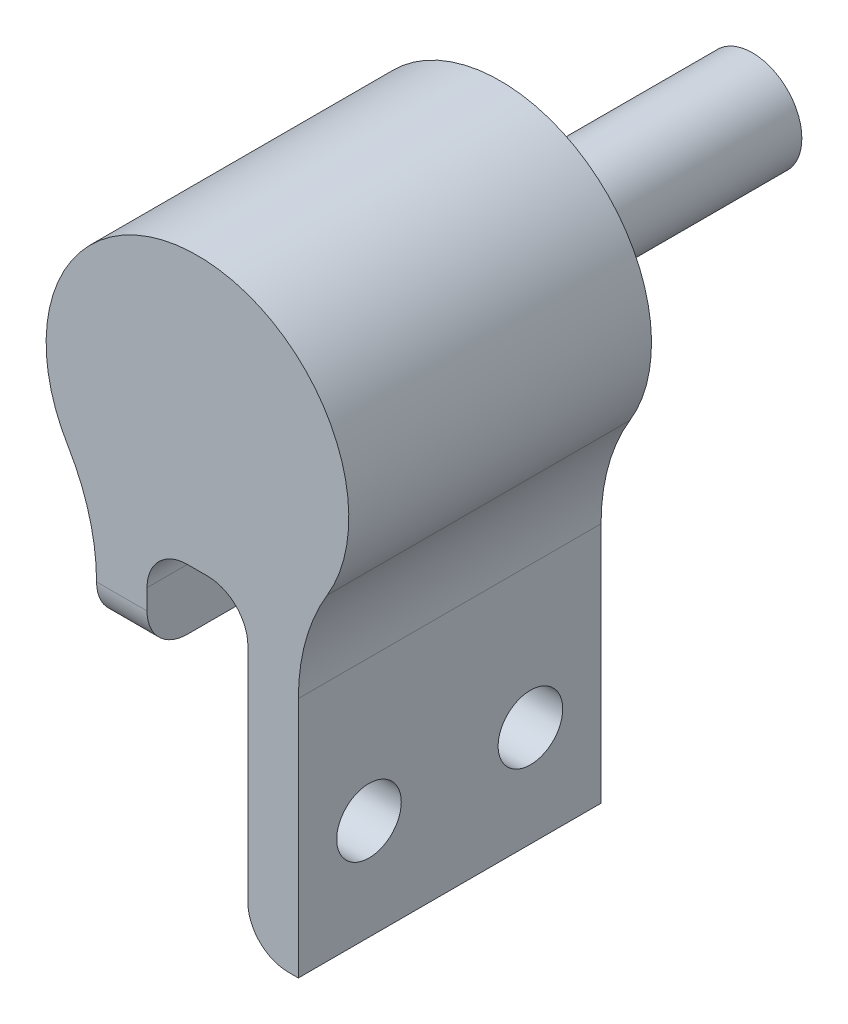
ISO-10303-21;
HEADER;
FILE_DESCRIPTION(('STEP AP214'),'2;1');
FILE_NAME('part.step','',(''),(''),'','','');
FILE_SCHEMA(('AUTOMOTIVE_DESIGN { 1 0 10303 214 1 1 1 1 }'));
ENDSEC;
DATA;
#1=APPLICATION_CONTEXT('core data for automotive mechanical design processes');
#2=APPLICATION_PROTOCOL_DEFINITION('international standard','automotive_design',2000,#1);
#3=PRODUCT_CONTEXT('',#1,'mechanical');
#4=PRODUCT('Part','Part','',(#3));
#5=PRODUCT_RELATED_PRODUCT_CATEGORY('part','',(#4));
#6=PRODUCT_DEFINITION_FORMATION('','',#4);
#7=PRODUCT_DEFINITION_CONTEXT('part definition',#1,'design');
#8=PRODUCT_DEFINITION('design','',#6,#7);
#9=PRODUCT_DEFINITION_SHAPE('','',#8);
#10=(LENGTH_UNIT() NAMED_UNIT(*) SI_UNIT(.MILLI.,.METRE.));
#11=(NAMED_UNIT(*) PLANE_ANGLE_UNIT() SI_UNIT($,.RADIAN.));
#12=(NAMED_UNIT(*) SI_UNIT($,.STERADIAN.) SOLID_ANGLE_UNIT());
#13=UNCERTAINTY_MEASURE_WITH_UNIT(LENGTH_MEASURE(1.E-05),#10,'distance_accuracy_value','');
#14=(GEOMETRIC_REPRESENTATION_CONTEXT(3) GLOBAL_UNCERTAINTY_ASSIGNED_CONTEXT((#13)) GLOBAL_UNIT_ASSIGNED_CONTEXT((#10,
#11,#12)) REPRESENTATION_CONTEXT('',''));
#15=CARTESIAN_POINT('',(0.,0.,0.));
#16=DIRECTION('',(0.,0.,1.));
#17=DIRECTION('',(1.,0.,0.));
#18=AXIS2_PLACEMENT_3D('',#15,#16,#17);
#19=CARTESIAN_POINT('',(-2.5,-6.00833564943505,15.));
#20=DIRECTION('',(0.,1.,0.));
#21=DIRECTION('',(0.,0.,1.));
#22=AXIS2_PLACEMENT_3D('',#19,#20,#21);
#23=PLANE('',#22);
#24=DIRECTION('',(1.,0.,0.));
#25=VECTOR('',#24,1.);
#26=CARTESIAN_POINT('',(-2.5,-6.00833564943505,0.));
#27=LINE('',#26,#25);
#28=CARTESIAN_POINT('',(-0.5,-6.00833564943505,0.));
#29=VERTEX_POINT('',#28);
#30=CARTESIAN_POINT('',(0.500000000000001,-6.00833564943505,0.));
#31=VERTEX_POINT('',#30);
#32=EDGE_CURVE('E362',#29,#31,#27,.T.);
#33=ORIENTED_EDGE('',*,*,#32,.T.);
#34=DIRECTION('',(0.,0.,-1.));
#35=VECTOR('',#34,1.);
#36=CARTESIAN_POINT('',(0.500000000000001,-6.00833564943505,15.));
#37=LINE('',#36,#35);
#38=CARTESIAN_POINT('',(0.500000000000001,-6.00833564943505,15.));
#39=VERTEX_POINT('',#38);
#40=EDGE_CURVE('E264',#31,#39,#37,.F.);
#41=ORIENTED_EDGE('',*,*,#40,.T.);
#42=DIRECTION('',(1.,0.,0.));
#43=VECTOR('',#42,1.);
#44=CARTESIAN_POINT('',(-2.5,-6.00833564943505,15.));
#45=LINE('',#44,#43);
#46=CARTESIAN_POINT('',(-0.5,-6.00833564943505,15.));
#47=VERTEX_POINT('',#46);
#48=EDGE_CURVE('E363',#47,#39,#45,.T.);
#49=ORIENTED_EDGE('',*,*,#48,.F.);
#50=DIRECTION('',(0.,0.,-1.));
#51=VECTOR('',#50,1.);
#52=CARTESIAN_POINT('',(-0.5,-6.00833564943505,0.));
#53=LINE('',#52,#51);
#54=EDGE_CURVE('E260',#47,#29,#53,.T.);
#55=ORIENTED_EDGE('',*,*,#54,.T.);
#56=EDGE_LOOP('',(#33,#41,#49,#55));
#57=FACE_BOUND('',#56,.T.);
#58=ADVANCED_FACE('F43',(#57),#23,.F.);
#59=CARTESIAN_POINT('',(2.5,-6.00833564943505,15.));
#60=DIRECTION('',(1.,0.,0.));
#61=DIRECTION('',(0.,1.,0.));
#62=AXIS2_PLACEMENT_3D('',#59,#60,#61);
#63=PLANE('',#62);
#64=CARTESIAN_POINT('',(2.5,-16.0083356494351,11.5));
#65=DIRECTION('',(1.,0.,0.));
#66=DIRECTION('',(0.,1.,0.));
#67=AXIS2_PLACEMENT_3D('',#64,#65,#66);
#68=CIRCLE('',#67,1.6);
#69=CARTESIAN_POINT('',(2.5,-14.408335649435,11.5));
#70=VERTEX_POINT('',#69);
#71=EDGE_CURVE('E339',#70,#70,#68,.F.);
#72=ORIENTED_EDGE('',*,*,#71,.F.);
#73=EDGE_LOOP('',(#72));
#74=FACE_BOUND('',#73,.T.);
#75=CARTESIAN_POINT('',(2.5,-16.0083356494351,3.5));
#76=DIRECTION('',(1.,0.,0.));
#77=DIRECTION('',(0.,1.,0.));
#78=AXIS2_PLACEMENT_3D('',#75,#76,#77);
#79=CIRCLE('',#78,1.6);
#80=CARTESIAN_POINT('',(2.5,-14.408335649435,3.5));
#81=VERTEX_POINT('',#80);
#82=EDGE_CURVE('E354',#81,#81,#79,.T.);
#83=ORIENTED_EDGE('',*,*,#82,.T.);
#84=EDGE_LOOP('',(#83));
#85=FACE_BOUND('',#84,.T.);
#86=DIRECTION('',(0.,-1.,0.));
#87=VECTOR('',#86,1.);
#88=CARTESIAN_POINT('',(2.5,-6.00833564943505,15.));
#89=LINE('',#88,#87);
#90=CARTESIAN_POINT('',(2.5,-8.00833564943505,15.));
#91=VERTEX_POINT('',#90);
#92=CARTESIAN_POINT('',(2.5,-19.008335649435,15.));
#93=VERTEX_POINT('',#92);
#94=EDGE_CURVE('E367',#91,#93,#89,.T.);
#95=ORIENTED_EDGE('',*,*,#94,.F.);
#96=DIRECTION('',(0.,0.,-1.));
#97=VECTOR('',#96,1.);
#98=CARTESIAN_POINT('',(2.5,-8.00833564943505,0.));
#99=LINE('',#98,#97);
#100=CARTESIAN_POINT('',(2.5,-8.00833564943505,0.));
#101=VERTEX_POINT('',#100);
#102=EDGE_CURVE('E256',#91,#101,#99,.T.);
#103=ORIENTED_EDGE('',*,*,#102,.T.);
#104=DIRECTION('',(0.,-1.,0.));
#105=VECTOR('',#104,1.);
#106=CARTESIAN_POINT('',(2.5,-6.00833564943505,0.));
#107=LINE('',#106,#105);
#108=CARTESIAN_POINT('',(2.5,-19.008335649435,0.));
#109=VERTEX_POINT('',#108);
#110=EDGE_CURVE('E384',#101,#109,#107,.T.);
#111=ORIENTED_EDGE('',*,*,#110,.T.);
#112=DIRECTION('',(0.,0.,-1.));
#113=VECTOR('',#112,1.);
#114=CARTESIAN_POINT('',(2.5,-19.008335649435,15.));
#115=LINE('',#114,#113);
#116=EDGE_CURVE('E253',#109,#93,#115,.F.);
#117=ORIENTED_EDGE('',*,*,#116,.T.);
#118=EDGE_LOOP('',(#95,#103,#111,#117));
#119=FACE_BOUND('',#118,.T.);
#120=ADVANCED_FACE('F422',(#74,#85,#119),#63,.F.);
#121=CARTESIAN_POINT('',(2.5,-21.0083356494351,15.));
#122=DIRECTION('',(0.,1.,0.));
#123=DIRECTION('',(0.,0.,1.));
#124=AXIS2_PLACEMENT_3D('',#121,#122,#123);
#125=PLANE('',#124);
#126=DIRECTION('',(1.,0.,0.));
#127=VECTOR('',#126,1.);
#128=CARTESIAN_POINT('',(2.5,-21.0083356494351,15.));
#129=LINE('',#128,#127);
#130=CARTESIAN_POINT('',(4.5,-21.0083356494351,15.));
#131=VERTEX_POINT('',#130);
#132=CARTESIAN_POINT('',(5.,-21.0083356494351,15.));
#133=VERTEX_POINT('',#132);
#134=EDGE_CURVE('E371',#131,#133,#129,.T.);
#135=ORIENTED_EDGE('',*,*,#134,.F.);
#136=DIRECTION('',(0.,0.,-1.));
#137=VECTOR('',#136,1.);
#138=CARTESIAN_POINT('',(4.5,-21.0083356494351,15.));
#139=LINE('',#138,#137);
#140=CARTESIAN_POINT('',(4.5,-21.0083356494351,0.));
#141=VERTEX_POINT('',#140);
#142=EDGE_CURVE('E304',#131,#141,#139,.T.);
#143=ORIENTED_EDGE('',*,*,#142,.T.);
#144=DIRECTION('',(1.,0.,0.));
#145=VECTOR('',#144,1.);
#146=CARTESIAN_POINT('',(2.5,-21.0083356494351,0.));
#147=LINE('',#146,#145);
#148=CARTESIAN_POINT('',(5.,-21.0083356494351,0.));
#149=VERTEX_POINT('',#148);
#150=EDGE_CURVE('E388',#141,#149,#147,.T.);
#151=ORIENTED_EDGE('',*,*,#150,.T.);
#152=DIRECTION('',(0.,0.,-1.));
#153=VECTOR('',#152,1.);
#154=CARTESIAN_POINT('',(5.,-21.0083356494351,15.));
#155=LINE('',#154,#153);
#156=EDGE_CURVE('E199',#133,#149,#155,.T.);
#157=ORIENTED_EDGE('',*,*,#156,.F.);
#158=EDGE_LOOP('',(#135,#143,#151,#157));
#159=FACE_BOUND('',#158,.T.);
#160=ADVANCED_FACE('F427',(#159),#125,.F.);
#161=CARTESIAN_POINT('',(5.,-6.00833564943505,15.));
#162=DIRECTION('',(-1.,0.,0.));
#163=DIRECTION('',(0.,0.,1.));
#164=AXIS2_PLACEMENT_3D('',#161,#162,#163);
#165=PLANE('',#164);
#166=CARTESIAN_POINT('',(5.,-16.0083356494351,11.5));
#167=DIRECTION('',(1.,0.,0.));
#168=DIRECTION('',(0.,0.,-1.));
#169=AXIS2_PLACEMENT_3D('',#166,#167,#168);
#170=CIRCLE('',#169,1.6);
#171=CARTESIAN_POINT('',(5.,-16.0083356494351,9.9));
#172=VERTEX_POINT('',#171);
#173=EDGE_CURVE('E345',#172,#172,#170,.T.);
#174=ORIENTED_EDGE('',*,*,#173,.F.);
#175=EDGE_LOOP('',(#174));
#176=FACE_BOUND('',#175,.T.);
#177=CARTESIAN_POINT('',(5.,-16.0083356494351,3.5));
#178=DIRECTION('',(1.,0.,0.));
#179=DIRECTION('',(0.,0.,-1.));
#180=AXIS2_PLACEMENT_3D('',#177,#178,#179);
#181=CIRCLE('',#180,1.6);
#182=CARTESIAN_POINT('',(5.,-16.0083356494351,1.9));
#183=VERTEX_POINT('',#182);
#184=EDGE_CURVE('E180',#183,#183,#181,.T.);
#185=ORIENTED_EDGE('',*,*,#184,.F.);
#186=EDGE_LOOP('',(#185));
#187=FACE_BOUND('',#186,.T.);
#188=DIRECTION('',(0.,1.,0.));
#189=VECTOR('',#188,1.);
#190=CARTESIAN_POINT('',(5.,-6.00833564943505,0.));
#191=LINE('',#190,#189);
#192=CARTESIAN_POINT('',(5.,-9.01387818865998,0.));
#193=VERTEX_POINT('',#192);
#194=EDGE_CURVE('E391',#149,#193,#191,.T.);
#195=ORIENTED_EDGE('',*,*,#194,.T.);
#196=DIRECTION('',(0.,0.,1.));
#197=VECTOR('',#196,1.);
#198=CARTESIAN_POINT('',(5.,-9.01387818865998,15.));
#199=LINE('',#198,#197);
#200=CARTESIAN_POINT('',(5.,-9.01387818865998,15.));
#201=VERTEX_POINT('',#200);
#202=EDGE_CURVE('E223',#193,#201,#199,.T.);
#203=ORIENTED_EDGE('',*,*,#202,.T.);
#204=DIRECTION('',(0.,1.,0.));
#205=VECTOR('',#204,1.);
#206=CARTESIAN_POINT('',(5.,-6.00833564943505,15.));
#207=LINE('',#206,#205);
#208=EDGE_CURVE('E374',#133,#201,#207,.T.);
#209=ORIENTED_EDGE('',*,*,#208,.F.);
#210=ORIENTED_EDGE('',*,*,#156,.T.);
#211=EDGE_LOOP('',(#195,#203,#209,#210));
#212=FACE_BOUND('',#211,.T.);
#213=ADVANCED_FACE('F432',(#176,#187,#212),#165,.F.);
#214=CARTESIAN_POINT('',(0.,0.,15.));
#215=DIRECTION('',(0.,0.,-1.));
#216=DIRECTION('',(-1.,0.,0.));
#217=AXIS2_PLACEMENT_3D('',#214,#215,#216);
#218=CYLINDRICAL_SURFACE('',#217,7.5);
#219=CARTESIAN_POINT('',(0.,0.,0.));
#220=DIRECTION('',(0.,0.,1.));
#221=DIRECTION('',(1.,0.,0.));
#222=AXIS2_PLACEMENT_3D('',#219,#220,#221);
#223=CIRCLE('',#222,7.5);
#224=CARTESIAN_POINT('',(6.42857142857143,-3.86309065228285,0.));
#225=VERTEX_POINT('',#224);
#226=CARTESIAN_POINT('',(-6.42857142857143,-3.86309065228285,0.));
#227=VERTEX_POINT('',#226);
#228=EDGE_CURVE('E395',#225,#227,#223,.T.);
#229=ORIENTED_EDGE('',*,*,#228,.T.);
#230=DIRECTION('',(0.,0.,-1.));
#231=VECTOR('',#230,1.);
#232=CARTESIAN_POINT('',(-6.42857142857143,-3.86309065228285,15.));
#233=LINE('',#232,#231);
#234=CARTESIAN_POINT('',(-6.42857142857143,-3.86309065228285,15.));
#235=VERTEX_POINT('',#234);
#236=EDGE_CURVE('E220',#227,#235,#233,.F.);
#237=ORIENTED_EDGE('',*,*,#236,.T.);
#238=CARTESIAN_POINT('',(0.,0.,15.));
#239=DIRECTION('',(0.,0.,1.));
#240=DIRECTION('',(1.,0.,0.));
#241=AXIS2_PLACEMENT_3D('',#238,#239,#240);
#242=CIRCLE('',#241,7.5);
#243=CARTESIAN_POINT('',(6.42857142857143,-3.86309065228285,15.));
#244=VERTEX_POINT('',#243);
#245=EDGE_CURVE('E208',#244,#235,#242,.T.);
#246=ORIENTED_EDGE('',*,*,#245,.F.);
#247=DIRECTION('',(0.,0.,-1.));
#248=VECTOR('',#247,1.);
#249=CARTESIAN_POINT('',(6.42857142857143,-3.86309065228285,15.));
#250=LINE('',#249,#248);
#251=EDGE_CURVE('E216',#244,#225,#250,.T.);
#252=ORIENTED_EDGE('',*,*,#251,.T.);
#253=EDGE_LOOP('',(#229,#237,#246,#252));
#254=FACE_BOUND('',#253,.T.);
#255=ADVANCED_FACE('F441',(#254),#218,.T.);
#256=CARTESIAN_POINT('',(-5.,-6.00833564943505,15.));
#257=DIRECTION('',(1.,0.,0.));
#258=DIRECTION('',(0.,1.,0.));
#259=AXIS2_PLACEMENT_3D('',#256,#257,#258);
#260=PLANE('',#259);
#261=CARTESIAN_POINT('',(-5.,-16.0083356494351,3.5));
#262=DIRECTION('',(1.,0.,0.));
#263=DIRECTION('',(0.,1.,0.));
#264=AXIS2_PLACEMENT_3D('',#261,#262,#263);
#265=CIRCLE('',#264,1.6);
#266=CARTESIAN_POINT('',(-5.,-16.0083356494351,1.9));
#267=VERTEX_POINT('',#266);
#268=EDGE_CURVE('E245',#267,#267,#265,.T.);
#269=ORIENTED_EDGE('',*,*,#268,.T.);
#270=EDGE_LOOP('',(#269));
#271=FACE_BOUND('',#270,.T.);
#272=DIRECTION('',(0.,0.,-1.));
#273=VECTOR('',#272,1.);
#274=CARTESIAN_POINT('',(-5.,-11.0083356494351,15.));
#275=LINE('',#274,#273);
#276=CARTESIAN_POINT('',(-5.,-11.0083356494351,13.));
#277=VERTEX_POINT('',#276);
#278=CARTESIAN_POINT('',(-5.,-11.0083356494351,9.5));
#279=VERTEX_POINT('',#278);
#280=EDGE_CURVE('E191',#277,#279,#275,.T.);
#281=ORIENTED_EDGE('',*,*,#280,.F.);
#282=CARTESIAN_POINT('',(-5.,-9.00833564943505,13.));
#283=DIRECTION('',(1.,0.,0.));
#284=DIRECTION('',(0.,1.,0.));
#285=AXIS2_PLACEMENT_3D('',#282,#283,#284);
#286=CIRCLE('',#285,2.);
#287=CARTESIAN_POINT('',(-5.,-9.01387818865998,15.));
#288=VERTEX_POINT('',#287);
#289=EDGE_CURVE('E289',#277,#288,#286,.F.);
#290=ORIENTED_EDGE('',*,*,#289,.T.);
#291=DIRECTION('',(0.,0.,1.));
#292=VECTOR('',#291,1.);
#293=CARTESIAN_POINT('',(-5.,-9.01387818865998,0.));
#294=LINE('',#293,#292);
#295=CARTESIAN_POINT('',(-5.,-9.01387818865998,0.));
#296=VERTEX_POINT('',#295);
#297=EDGE_CURVE('E205',#288,#296,#294,.F.);
#298=ORIENTED_EDGE('',*,*,#297,.T.);
#299=DIRECTION('',(0.,-1.,0.));
#300=VECTOR('',#299,1.);
#301=CARTESIAN_POINT('',(-5.,-6.00833564943505,0.));
#302=LINE('',#301,#300);
#303=CARTESIAN_POINT('',(-5.,-21.0083356494351,0.));
#304=VERTEX_POINT('',#303);
#305=EDGE_CURVE('E197',#296,#304,#302,.T.);
#306=ORIENTED_EDGE('',*,*,#305,.T.);
#307=DIRECTION('',(0.,0.,-1.));
#308=VECTOR('',#307,1.);
#309=CARTESIAN_POINT('',(-5.,-21.0083356494351,15.));
#310=LINE('',#309,#308);
#311=CARTESIAN_POINT('',(-5.,-21.0083356494351,7.5));
#312=VERTEX_POINT('',#311);
#313=EDGE_CURVE('E173',#312,#304,#310,.T.);
#314=ORIENTED_EDGE('',*,*,#313,.F.);
#315=DIRECTION('',(0.,-1.,0.));
#316=VECTOR('',#315,1.);
#317=CARTESIAN_POINT('',(-5.,-21.0083356494351,7.5));
#318=LINE('',#317,#316);
#319=CARTESIAN_POINT('',(-5.,-13.0083356494351,7.5));
#320=VERTEX_POINT('',#319);
#321=EDGE_CURVE('E181',#320,#312,#318,.T.);
#322=ORIENTED_EDGE('',*,*,#321,.F.);
#323=CARTESIAN_POINT('',(-5.,-13.0083356494351,9.5));
#324=DIRECTION('',(1.,0.,0.));
#325=DIRECTION('',(0.,1.,0.));
#326=AXIS2_PLACEMENT_3D('',#323,#324,#325);
#327=CIRCLE('',#326,2.);
#328=EDGE_CURVE('E52',#320,#279,#327,.T.);
#329=ORIENTED_EDGE('',*,*,#328,.T.);
#330=EDGE_LOOP('',(#281,#290,#298,#306,#314,#322,#329));
#331=FACE_BOUND('',#330,.T.);
#332=ADVANCED_FACE('F194',(#271,#331),#260,.F.);
#333=CARTESIAN_POINT('',(-5.,-21.0083356494351,15.));
#334=DIRECTION('',(0.,1.,0.));
#335=DIRECTION('',(0.,0.,1.));
#336=AXIS2_PLACEMENT_3D('',#333,#334,#335);
#337=PLANE('',#336);
#338=DIRECTION('',(1.,0.,0.));
#339=VECTOR('',#338,1.);
#340=CARTESIAN_POINT('',(-5.,-21.0083356494351,0.));
#341=LINE('',#340,#339);
#342=CARTESIAN_POINT('',(-4.5,-21.0083356494351,0.));
#343=VERTEX_POINT('',#342);
#344=EDGE_CURVE('E400',#304,#343,#341,.T.);
#345=ORIENTED_EDGE('',*,*,#344,.T.);
#346=DIRECTION('',(0.,0.,-1.));
#347=VECTOR('',#346,1.);
#348=CARTESIAN_POINT('',(-4.5,-21.0083356494351,15.));
#349=LINE('',#348,#347);
#350=CARTESIAN_POINT('',(-4.5,-21.0083356494351,7.5));
#351=VERTEX_POINT('',#350);
#352=EDGE_CURVE('E176',#343,#351,#349,.F.);
#353=ORIENTED_EDGE('',*,*,#352,.T.);
#354=DIRECTION('',(-1.,0.,0.));
#355=VECTOR('',#354,1.);
#356=CARTESIAN_POINT('',(7.501,-21.0083356494351,7.5));
#357=LINE('',#356,#355);
#358=EDGE_CURVE('E169',#351,#312,#357,.T.);
#359=ORIENTED_EDGE('',*,*,#358,.T.);
#360=ORIENTED_EDGE('',*,*,#313,.T.);
#361=EDGE_LOOP('',(#345,#353,#359,#360));
#362=FACE_BOUND('',#361,.T.);
#363=ADVANCED_FACE('F171',(#362),#337,.F.);
#364=CARTESIAN_POINT('',(-2.5,-6.00833564943505,15.));
#365=DIRECTION('',(-1.,0.,0.));
#366=DIRECTION('',(0.,-1.,0.));
#367=AXIS2_PLACEMENT_3D('',#364,#365,#366);
#368=PLANE('',#367);
#369=CARTESIAN_POINT('',(-2.5,-16.0083356494351,3.5));
#370=DIRECTION('',(-1.,0.,0.));
#371=DIRECTION('',(0.,-1.,0.));
#372=AXIS2_PLACEMENT_3D('',#369,#370,#371);
#373=CIRCLE('',#372,1.6);
#374=CARTESIAN_POINT('',(-2.5,-16.0083356494351,1.9));
#375=VERTEX_POINT('',#374);
#376=EDGE_CURVE('E241',#375,#375,#373,.T.);
#377=ORIENTED_EDGE('',*,*,#376,.T.);
#378=EDGE_LOOP('',(#377));
#379=FACE_BOUND('',#378,.T.);
#380=DIRECTION('',(0.,1.,0.));
#381=VECTOR('',#380,1.);
#382=CARTESIAN_POINT('',(-2.5,-6.00833564943505,0.));
#383=LINE('',#382,#381);
#384=CARTESIAN_POINT('',(-2.5,-19.008335649435,0.));
#385=VERTEX_POINT('',#384);
#386=CARTESIAN_POINT('',(-2.5,-8.00833564943505,0.));
#387=VERTEX_POINT('',#386);
#388=EDGE_CURVE('E211',#385,#387,#383,.T.);
#389=ORIENTED_EDGE('',*,*,#388,.T.);
#390=DIRECTION('',(0.,0.,-1.));
#391=VECTOR('',#390,1.);
#392=CARTESIAN_POINT('',(-2.5,-8.00833564943505,15.));
#393=LINE('',#392,#391);
#394=CARTESIAN_POINT('',(-2.5,-8.00833564943505,15.));
#395=VERTEX_POINT('',#394);
#396=EDGE_CURVE('E274',#387,#395,#393,.F.);
#397=ORIENTED_EDGE('',*,*,#396,.T.);
#398=DIRECTION('',(0.,1.,0.));
#399=VECTOR('',#398,1.);
#400=CARTESIAN_POINT('',(-2.5,-6.00833564943505,15.));
#401=LINE('',#400,#399);
#402=CARTESIAN_POINT('',(-2.5,-9.00833564943505,15.));
#403=VERTEX_POINT('',#402);
#404=EDGE_CURVE('E200',#403,#395,#401,.T.);
#405=ORIENTED_EDGE('',*,*,#404,.F.);
#406=CARTESIAN_POINT('',(-2.5,-9.00833564943505,13.));
#407=DIRECTION('',(-1.,0.,0.));
#408=DIRECTION('',(0.,-1.,0.));
#409=AXIS2_PLACEMENT_3D('',#406,#407,#408);
#410=CIRCLE('',#409,2.);
#411=CARTESIAN_POINT('',(-2.5,-11.0083356494351,13.));
#412=VERTEX_POINT('',#411);
#413=EDGE_CURVE('E271',#403,#412,#410,.F.);
#414=ORIENTED_EDGE('',*,*,#413,.T.);
#415=DIRECTION('',(0.,0.,1.));
#416=VECTOR('',#415,1.);
#417=CARTESIAN_POINT('',(-2.5,-11.0083356494351,15.));
#418=LINE('',#417,#416);
#419=CARTESIAN_POINT('',(-2.5,-11.0083356494351,9.5));
#420=VERTEX_POINT('',#419);
#421=EDGE_CURVE('E328',#420,#412,#418,.T.);
#422=ORIENTED_EDGE('',*,*,#421,.F.);
#423=CARTESIAN_POINT('',(-2.5,-13.0083356494351,9.5));
#424=DIRECTION('',(-1.,0.,0.));
#425=DIRECTION('',(0.,-1.,0.));
#426=AXIS2_PLACEMENT_3D('',#423,#424,#425);
#427=CIRCLE('',#426,2.);
#428=CARTESIAN_POINT('',(-2.5,-13.0083356494351,7.5));
#429=VERTEX_POINT('',#428);
#430=EDGE_CURVE('E11',#420,#429,#427,.T.);
#431=ORIENTED_EDGE('',*,*,#430,.T.);
#432=DIRECTION('',(0.,1.,0.));
#433=VECTOR('',#432,1.);
#434=CARTESIAN_POINT('',(-2.5,-21.0083356494351,7.5));
#435=LINE('',#434,#433);
#436=CARTESIAN_POINT('',(-2.5,-19.008335649435,7.5));
#437=VERTEX_POINT('',#436);
#438=EDGE_CURVE('E336',#437,#429,#435,.T.);
#439=ORIENTED_EDGE('',*,*,#438,.F.);
#440=DIRECTION('',(0.,0.,-1.));
#441=VECTOR('',#440,1.);
#442=CARTESIAN_POINT('',(-2.5,-19.008335649435,15.));
#443=LINE('',#442,#441);
#444=EDGE_CURVE('E267',#437,#385,#443,.T.);
#445=ORIENTED_EDGE('',*,*,#444,.T.);
#446=EDGE_LOOP('',(#389,#397,#405,#414,#422,#431,#439,#445));
#447=FACE_BOUND('',#446,.T.);
#448=ADVANCED_FACE('F335',(#379,#447),#368,.F.);
#449=CARTESIAN_POINT('',(0.,0.,15.));
#450=DIRECTION('',(0.,0.,1.));
#451=DIRECTION('',(1.,0.,0.));
#452=AXIS2_PLACEMENT_3D('',#449,#450,#451);
#453=PLANE('',#452);
#454=CARTESIAN_POINT('',(-15.,-9.01387818865998,15.));
#455=DIRECTION('',(0.,0.,1.));
#456=DIRECTION('',(1.,0.,0.));
#457=AXIS2_PLACEMENT_3D('',#454,#455,#456);
#458=CIRCLE('',#457,10.);
#459=CARTESIAN_POINT('',(-5.00000153598717,-9.00833564943505,15.));
#460=VERTEX_POINT('',#459);
#461=EDGE_CURVE('E230',#235,#460,#458,.F.);
#462=ORIENTED_EDGE('',*,*,#461,.T.);
#463=DIRECTION('',(-1.,0.,0.));
#464=VECTOR('',#463,1.);
#465=CARTESIAN_POINT('',(-2.5,-9.00833564943505,15.));
#466=LINE('',#465,#464);
#467=EDGE_CURVE('E295',#460,#403,#466,.F.);
#468=ORIENTED_EDGE('',*,*,#467,.T.);
#469=ORIENTED_EDGE('',*,*,#404,.T.);
#470=CARTESIAN_POINT('',(-0.5,-8.00833564943505,15.));
#471=DIRECTION('',(0.,0.,1.));
#472=DIRECTION('',(1.,0.,0.));
#473=AXIS2_PLACEMENT_3D('',#470,#471,#472);
#474=CIRCLE('',#473,2.);
#475=EDGE_CURVE('E316',#395,#47,#474,.F.);
#476=ORIENTED_EDGE('',*,*,#475,.T.);
#477=ORIENTED_EDGE('',*,*,#48,.T.);
#478=CARTESIAN_POINT('',(0.500000000000001,-8.00833564943505,15.));
#479=DIRECTION('',(0.,0.,1.));
#480=DIRECTION('',(1.,0.,0.));
#481=AXIS2_PLACEMENT_3D('',#478,#479,#480);
#482=CIRCLE('',#481,2.);
#483=EDGE_CURVE('E310',#39,#91,#482,.F.);
#484=ORIENTED_EDGE('',*,*,#483,.T.);
#485=ORIENTED_EDGE('',*,*,#94,.T.);
#486=CARTESIAN_POINT('',(4.5,-19.008335649435,15.));
#487=DIRECTION('',(0.,0.,1.));
#488=DIRECTION('',(1.,0.,0.));
#489=AXIS2_PLACEMENT_3D('',#486,#487,#488);
#490=CIRCLE('',#489,2.);
#491=EDGE_CURVE('E292',#93,#131,#490,.T.);
#492=ORIENTED_EDGE('',*,*,#491,.T.);
#493=ORIENTED_EDGE('',*,*,#134,.T.);
#494=ORIENTED_EDGE('',*,*,#208,.T.);
#495=CARTESIAN_POINT('',(15.,-9.01387818865998,15.));
#496=DIRECTION('',(0.,0.,1.));
#497=DIRECTION('',(1.,0.,0.));
#498=AXIS2_PLACEMENT_3D('',#495,#496,#497);
#499=CIRCLE('',#498,10.);
#500=EDGE_CURVE('E237',#201,#244,#499,.F.);
#501=ORIENTED_EDGE('',*,*,#500,.T.);
#502=ORIENTED_EDGE('',*,*,#245,.T.);
#503=EDGE_LOOP('',(#462,#468,#469,#476,#477,#484,#485,#492,#493,#494,#501,#502));
#504=FACE_BOUND('',#503,.T.);
#505=ADVANCED_FACE('F411',(#504),#453,.T.);
#506=CARTESIAN_POINT('',(0.,0.,0.));
#507=DIRECTION('',(0.,0.,1.));
#508=DIRECTION('',(1.,0.,0.));
#509=AXIS2_PLACEMENT_3D('',#506,#507,#508);
#510=PLANE('',#509);
#511=CARTESIAN_POINT('',(0.,0.,0.));
#512=DIRECTION('',(0.,0.,1.));
#513=DIRECTION('',(1.,0.,0.));
#514=AXIS2_PLACEMENT_3D('',#511,#512,#513);
#515=CIRCLE('',#514,3.45);
#516=CARTESIAN_POINT('',(3.45,0.,0.));
#517=VERTEX_POINT('',#516);
#518=EDGE_CURVE('E249',#517,#517,#515,.T.);
#519=ORIENTED_EDGE('',*,*,#518,.T.);
#520=EDGE_LOOP('',(#519));
#521=FACE_BOUND('',#520,.T.);
#522=ORIENTED_EDGE('',*,*,#388,.F.);
#523=CARTESIAN_POINT('',(-4.5,-19.008335649435,0.));
#524=DIRECTION('',(0.,0.,1.));
#525=DIRECTION('',(1.,0.,0.));
#526=AXIS2_PLACEMENT_3D('',#523,#524,#525);
#527=CIRCLE('',#526,2.);
#528=EDGE_CURVE('E67',#385,#343,#527,.F.);
#529=ORIENTED_EDGE('',*,*,#528,.T.);
#530=ORIENTED_EDGE('',*,*,#344,.F.);
#531=ORIENTED_EDGE('',*,*,#305,.F.);
#532=CARTESIAN_POINT('',(-15.,-9.01387818865998,0.));
#533=DIRECTION('',(0.,0.,1.));
#534=DIRECTION('',(1.,0.,0.));
#535=AXIS2_PLACEMENT_3D('',#532,#533,#534);
#536=CIRCLE('',#535,10.);
#537=EDGE_CURVE('E226',#296,#227,#536,.T.);
#538=ORIENTED_EDGE('',*,*,#537,.T.);
#539=ORIENTED_EDGE('',*,*,#228,.F.);
#540=CARTESIAN_POINT('',(15.,-9.01387818865998,0.));
#541=DIRECTION('',(0.,0.,1.));
#542=DIRECTION('',(1.,0.,0.));
#543=AXIS2_PLACEMENT_3D('',#540,#541,#542);
#544=CIRCLE('',#543,10.);
#545=EDGE_CURVE('E234',#225,#193,#544,.T.);
#546=ORIENTED_EDGE('',*,*,#545,.T.);
#547=ORIENTED_EDGE('',*,*,#194,.F.);
#548=ORIENTED_EDGE('',*,*,#150,.F.);
#549=CARTESIAN_POINT('',(4.5,-19.008335649435,0.));
#550=DIRECTION('',(0.,0.,1.));
#551=DIRECTION('',(1.,0.,0.));
#552=AXIS2_PLACEMENT_3D('',#549,#550,#551);
#553=CIRCLE('',#552,2.);
#554=EDGE_CURVE('E59',#141,#109,#553,.F.);
#555=ORIENTED_EDGE('',*,*,#554,.T.);
#556=ORIENTED_EDGE('',*,*,#110,.F.);
#557=CARTESIAN_POINT('',(0.500000000000001,-8.00833564943505,0.));
#558=DIRECTION('',(0.,0.,1.));
#559=DIRECTION('',(1.,0.,0.));
#560=AXIS2_PLACEMENT_3D('',#557,#558,#559);
#561=CIRCLE('',#560,2.);
#562=EDGE_CURVE('E307',#101,#31,#561,.T.);
#563=ORIENTED_EDGE('',*,*,#562,.T.);
#564=ORIENTED_EDGE('',*,*,#32,.F.);
#565=CARTESIAN_POINT('',(-0.5,-8.00833564943505,0.));
#566=DIRECTION('',(0.,0.,1.));
#567=DIRECTION('',(1.,0.,0.));
#568=AXIS2_PLACEMENT_3D('',#565,#566,#567);
#569=CIRCLE('',#568,2.);
#570=EDGE_CURVE('E313',#29,#387,#569,.T.);
#571=ORIENTED_EDGE('',*,*,#570,.T.);
#572=EDGE_LOOP('',(#522,#529,#530,#531,#538,#539,#546,#547,#548,#555,#556,#563,#564,#571));
#573=FACE_BOUND('',#572,.T.);
#574=ADVANCED_FACE('F443',(#521,#573),#510,.F.);
#575=CARTESIAN_POINT('',(0.,0.,-12.5));
#576=DIRECTION('',(0.,0.,1.));
#577=DIRECTION('',(1.,0.,0.));
#578=AXIS2_PLACEMENT_3D('',#575,#576,#577);
#579=CYLINDRICAL_SURFACE('',#578,2.45);
#580=CARTESIAN_POINT('',(0.,0.,-1.));
#581=DIRECTION('',(0.,0.,1.));
#582=DIRECTION('',(1.,0.,0.));
#583=AXIS2_PLACEMENT_3D('',#580,#581,#582);
#584=CIRCLE('',#583,2.45);
#585=CARTESIAN_POINT('',(2.45,0.,-1.));
#586=VERTEX_POINT('',#585);
#587=EDGE_CURVE('E240',#586,#586,#584,.F.);
#588=ORIENTED_EDGE('',*,*,#587,.T.);
#589=EDGE_LOOP('',(#588));
#590=FACE_BOUND('',#589,.T.);
#591=CARTESIAN_POINT('',(0.,0.,-12.5));
#592=DIRECTION('',(0.,0.,-1.));
#593=DIRECTION('',(-1.,0.,0.));
#594=AXIS2_PLACEMENT_3D('',#591,#592,#593);
#595=CIRCLE('',#594,2.45);
#596=CARTESIAN_POINT('',(-2.45,0.,-12.5));
#597=VERTEX_POINT('',#596);
#598=EDGE_CURVE('E358',#597,#597,#595,.T.);
#599=ORIENTED_EDGE('',*,*,#598,.F.);
#600=EDGE_LOOP('',(#599));
#601=FACE_BOUND('',#600,.T.);
#602=ADVANCED_FACE('F598',(#590,#601),#579,.T.);
#603=CARTESIAN_POINT('',(0.,0.,-12.5));
#604=DIRECTION('',(0.,0.,-1.));
#605=DIRECTION('',(-1.,0.,0.));
#606=AXIS2_PLACEMENT_3D('',#603,#604,#605);
#607=PLANE('',#606);
#608=ORIENTED_EDGE('',*,*,#598,.T.);
#609=EDGE_LOOP('',(#608));
#610=FACE_BOUND('',#609,.T.);
#611=ADVANCED_FACE('F474',(#610),#607,.T.);
#612=CARTESIAN_POINT('',(-15.,-9.01387818865998,15.));
#613=DIRECTION('',(0.,0.,-1.));
#614=DIRECTION('',(-1.,0.,0.));
#615=AXIS2_PLACEMENT_3D('',#612,#613,#614);
#616=CYLINDRICAL_SURFACE('',#615,10.);
#617=ORIENTED_EDGE('',*,*,#461,.F.);
#618=ORIENTED_EDGE('',*,*,#236,.F.);
#619=ORIENTED_EDGE('',*,*,#537,.F.);
#620=ORIENTED_EDGE('',*,*,#297,.F.);
#621=EDGE_CURVE('E229',#460,#288,#458,.F.);
#622=ORIENTED_EDGE('',*,*,#621,.F.);
#623=EDGE_LOOP('',(#617,#618,#619,#620,#622));
#624=FACE_BOUND('',#623,.T.);
#625=ADVANCED_FACE('F447',(#624),#616,.F.);
#626=CARTESIAN_POINT('',(15.,-9.01387818865998,15.));
#627=DIRECTION('',(0.,0.,-1.));
#628=DIRECTION('',(-1.,0.,0.));
#629=AXIS2_PLACEMENT_3D('',#626,#627,#628);
#630=CYLINDRICAL_SURFACE('',#629,10.);
#631=ORIENTED_EDGE('',*,*,#500,.F.);
#632=ORIENTED_EDGE('',*,*,#202,.F.);
#633=ORIENTED_EDGE('',*,*,#545,.F.);
#634=ORIENTED_EDGE('',*,*,#251,.F.);
#635=EDGE_LOOP('',(#631,#632,#633,#634));
#636=FACE_BOUND('',#635,.T.);
#637=ADVANCED_FACE('F438',(#636),#630,.F.);
#638=CARTESIAN_POINT('',(-7.5,-16.0083356494351,3.5));
#639=DIRECTION('',(1.,0.,0.));
#640=DIRECTION('',(0.,0.,-1.));
#641=AXIS2_PLACEMENT_3D('',#638,#639,#640);
#642=CYLINDRICAL_SURFACE('',#641,1.6);
#643=CARTESIAN_POINT('',(-2.5,-16.0083356494351,1.9));
#644=CARTESIAN_POINT('',(-2.52604166666666,-16.0083356494351,1.9));
#645=CARTESIAN_POINT('',(-2.55208333333333,-16.0083356494351,1.9));
#646=CARTESIAN_POINT('',(-2.60416666666666,-16.0083356494351,1.9));
#647=CARTESIAN_POINT('',(-2.63020833333333,-16.0083356494351,1.9));
#648=CARTESIAN_POINT('',(-2.68229166666666,-16.0083356494351,1.9));
#649=CARTESIAN_POINT('',(-2.70833333333333,-16.0083356494351,1.9));
#650=CARTESIAN_POINT('',(-2.76041666666666,-16.0083356494351,1.9));
#651=CARTESIAN_POINT('',(-2.78645833333333,-16.0083356494351,1.9));
#652=CARTESIAN_POINT('',(-2.83854166666667,-16.0083356494351,1.9));
#653=CARTESIAN_POINT('',(-2.86458333333333,-16.0083356494351,1.9));
#654=CARTESIAN_POINT('',(-2.91666666666667,-16.0083356494351,1.9));
#655=CARTESIAN_POINT('',(-2.94270833333333,-16.0083356494351,1.9));
#656=CARTESIAN_POINT('',(-2.99479166666667,-16.0083356494351,1.9));
#657=CARTESIAN_POINT('',(-3.02083333333333,-16.0083356494351,1.9));
#658=CARTESIAN_POINT('',(-3.07291666666667,-16.0083356494351,1.9));
#659=CARTESIAN_POINT('',(-3.09895833333333,-16.0083356494351,1.9));
#660=CARTESIAN_POINT('',(-3.15104166666667,-16.0083356494351,1.9));
#661=CARTESIAN_POINT('',(-3.17708333333333,-16.0083356494351,1.9));
#662=CARTESIAN_POINT('',(-3.22916666666667,-16.0083356494351,1.9));
#663=CARTESIAN_POINT('',(-3.25520833333333,-16.0083356494351,1.9));
#664=CARTESIAN_POINT('',(-3.30729166666667,-16.0083356494351,1.9));
#665=CARTESIAN_POINT('',(-3.33333333333333,-16.0083356494351,1.9));
#666=CARTESIAN_POINT('',(-3.38541666666667,-16.0083356494351,1.9));
#667=CARTESIAN_POINT('',(-3.41145833333333,-16.0083356494351,1.9));
#668=CARTESIAN_POINT('',(-3.46354166666667,-16.0083356494351,1.9));
#669=CARTESIAN_POINT('',(-3.48958333333333,-16.0083356494351,1.9));
#670=CARTESIAN_POINT('',(-3.54166666666667,-16.0083356494351,1.9));
#671=CARTESIAN_POINT('',(-3.56770833333333,-16.0083356494351,1.9));
#672=CARTESIAN_POINT('',(-3.61979166666667,-16.0083356494351,1.9));
#673=CARTESIAN_POINT('',(-3.64583333333333,-16.0083356494351,1.9));
#674=CARTESIAN_POINT('',(-3.69791666666667,-16.0083356494351,1.9));
#675=CARTESIAN_POINT('',(-3.72395833333333,-16.0083356494351,1.9));
#676=CARTESIAN_POINT('',(-3.77604166666667,-16.0083356494351,1.9));
#677=CARTESIAN_POINT('',(-3.80208333333333,-16.0083356494351,1.9));
#678=CARTESIAN_POINT('',(-3.85416666666667,-16.0083356494351,1.9));
#679=CARTESIAN_POINT('',(-3.88020833333333,-16.0083356494351,1.9));
#680=CARTESIAN_POINT('',(-3.93229166666667,-16.0083356494351,1.9));
#681=CARTESIAN_POINT('',(-3.95833333333333,-16.0083356494351,1.9));
#682=CARTESIAN_POINT('',(-4.01041666666667,-16.0083356494351,1.9));
#683=CARTESIAN_POINT('',(-4.03645833333333,-16.0083356494351,1.9));
#684=CARTESIAN_POINT('',(-4.08854166666667,-16.0083356494351,1.9));
#685=CARTESIAN_POINT('',(-4.11458333333333,-16.0083356494351,1.9));
#686=CARTESIAN_POINT('',(-4.16666666666667,-16.0083356494351,1.9));
#687=CARTESIAN_POINT('',(-4.19270833333333,-16.0083356494351,1.9));
#688=CARTESIAN_POINT('',(-4.24479166666667,-16.0083356494351,1.9));
#689=CARTESIAN_POINT('',(-4.27083333333333,-16.0083356494351,1.9));
#690=CARTESIAN_POINT('',(-4.32291666666667,-16.0083356494351,1.9));
#691=CARTESIAN_POINT('',(-4.34895833333333,-16.0083356494351,1.9));
#692=CARTESIAN_POINT('',(-4.40104166666667,-16.0083356494351,1.9));
#693=CARTESIAN_POINT('',(-4.42708333333333,-16.0083356494351,1.9));
#694=CARTESIAN_POINT('',(-4.47916666666667,-16.0083356494351,1.9));
#695=CARTESIAN_POINT('',(-4.50520833333333,-16.0083356494351,1.9));
#696=CARTESIAN_POINT('',(-4.55729166666667,-16.0083356494351,1.9));
#697=CARTESIAN_POINT('',(-4.58333333333333,-16.0083356494351,1.9));
#698=CARTESIAN_POINT('',(-4.63541666666667,-16.0083356494351,1.9));
#699=CARTESIAN_POINT('',(-4.66145833333333,-16.0083356494351,1.9));
#700=CARTESIAN_POINT('',(-4.71354166666667,-16.0083356494351,1.9));
#701=CARTESIAN_POINT('',(-4.73958333333333,-16.0083356494351,1.9));
#702=CARTESIAN_POINT('',(-4.79166666666667,-16.0083356494351,1.9));
#703=CARTESIAN_POINT('',(-4.81770833333333,-16.0083356494351,1.9));
#704=CARTESIAN_POINT('',(-4.86979166666667,-16.0083356494351,1.9));
#705=CARTESIAN_POINT('',(-4.89583333333333,-16.0083356494351,1.9));
#706=CARTESIAN_POINT('',(-4.94791666666667,-16.0083356494351,1.9));
#707=CARTESIAN_POINT('',(-4.97395833333333,-16.0083356494351,1.9));
#708=CARTESIAN_POINT('',(-5.,-16.0083356494351,1.9));
#709=B_SPLINE_CURVE_WITH_KNOTS('',3,(#643,#644,#645,#646,#647,#648,#649,#650,#651,#652,#653,
#654,#655,#656,#657,#658,#659,#660,#661,#662,#663,#664,#665,#666,#667,#668,#669,#670,#671,#672,
#673,#674,#675,#676,#677,#678,#679,#680,#681,#682,#683,#684,#685,#686,#687,#688,#689,#690,#691,
#692,#693,#694,#695,#696,#697,#698,#699,#700,#701,#702,#703,#704,#705,#706,#707,#708),
.UNSPECIFIED.,.F.,.F.,(4,2,2,2,2,2,2,2,2,2,2,2,2,2,2,2,2,2,2,2,2,2,2,2,2,2,2,2,2,2,2,2,4),(0.,
0.0781250000000001,0.15625,0.234375,0.3125,0.390625,0.46875,0.546875,0.625000000000001,
0.703125000000001,0.781250000000001,0.859375000000001,0.937500000000001,1.015625,1.09375,
1.171875,1.25,1.328125,1.40625,1.484375,1.5625,1.640625,1.71875,1.796875,1.875,1.953125,2.03125,
2.109375,2.1875,2.265625,2.34375,2.421875,2.5),.UNSPECIFIED.);
#710=EDGE_CURVE('BSEAM477',#375,#267,#709,.T.);
#711=ORIENTED_EDGE('',*,*,#376,.F.);
#712=ORIENTED_EDGE('',*,*,#268,.F.);
#713=ORIENTED_EDGE('',*,*,#710,.T.);
#714=ORIENTED_EDGE('',*,*,#710,.F.);
#715=EDGE_LOOP('',(#711,#713,#712,#714));
#716=FACE_BOUND('',#715,.T.);
#717=ADVANCED_FACE('F477',(#716),#642,.F.);
#718=ORIENTED_EDGE('',*,*,#184,.T.);
#719=EDGE_LOOP('',(#718));
#720=FACE_BOUND('',#719,.T.);
#721=ORIENTED_EDGE('',*,*,#82,.F.);
#722=EDGE_LOOP('',(#721));
#723=FACE_BOUND('',#722,.T.);
#724=ADVANCED_FACE('F560',(#720,#723),#642,.F.);
#725=CARTESIAN_POINT('',(7.501,-11.008335649435,15.));
#726=DIRECTION('',(0.,1.,0.));
#727=DIRECTION('',(0.,0.,1.));
#728=AXIS2_PLACEMENT_3D('',#725,#726,#727);
#729=PLANE('',#728);
#730=ORIENTED_EDGE('',*,*,#280,.T.);
#731=DIRECTION('',(-1.,0.,0.));
#732=VECTOR('',#731,1.);
#733=CARTESIAN_POINT('',(-2.5,-11.0083356494351,9.5));
#734=LINE('',#733,#732);
#735=EDGE_CURVE('E286',#279,#420,#734,.F.);
#736=ORIENTED_EDGE('',*,*,#735,.T.);
#737=ORIENTED_EDGE('',*,*,#421,.T.);
#738=DIRECTION('',(-1.,0.,0.));
#739=VECTOR('',#738,1.);
#740=CARTESIAN_POINT('',(-5.,-11.0083356494351,13.));
#741=LINE('',#740,#739);
#742=EDGE_CURVE('E282',#412,#277,#741,.T.);
#743=ORIENTED_EDGE('',*,*,#742,.T.);
#744=EDGE_LOOP('',(#730,#736,#737,#743));
#745=FACE_BOUND('',#744,.T.);
#746=ADVANCED_FACE('F323',(#745),#729,.F.);
#747=CARTESIAN_POINT('',(7.501,-21.0083356494351,7.5));
#748=DIRECTION('',(0.,0.,-1.));
#749=DIRECTION('',(-1.,0.,0.));
#750=AXIS2_PLACEMENT_3D('',#747,#748,#749);
#751=PLANE('',#750);
#752=ORIENTED_EDGE('',*,*,#438,.T.);
#753=DIRECTION('',(-1.,0.,0.));
#754=VECTOR('',#753,1.);
#755=CARTESIAN_POINT('',(-5.,-13.0083356494351,7.5));
#756=LINE('',#755,#754);
#757=EDGE_CURVE('E188',#429,#320,#756,.T.);
#758=ORIENTED_EDGE('',*,*,#757,.T.);
#759=ORIENTED_EDGE('',*,*,#321,.T.);
#760=ORIENTED_EDGE('',*,*,#358,.F.);
#761=CARTESIAN_POINT('',(-4.5,-19.008335649435,7.5));
#762=DIRECTION('',(0.,0.,-1.));
#763=DIRECTION('',(-1.,0.,0.));
#764=AXIS2_PLACEMENT_3D('',#761,#762,#763);
#765=CIRCLE('',#764,2.);
#766=EDGE_CURVE('E277',#351,#437,#765,.F.);
#767=ORIENTED_EDGE('',*,*,#766,.T.);
#768=EDGE_LOOP('',(#752,#758,#759,#760,#767));
#769=FACE_BOUND('',#768,.T.);
#770=ADVANCED_FACE('F186',(#769),#751,.F.);
#771=CARTESIAN_POINT('',(-7.501,-16.0083356494351,11.5));
#772=DIRECTION('',(1.,0.,0.));
#773=DIRECTION('',(0.,0.,-1.));
#774=AXIS2_PLACEMENT_3D('',#771,#772,#773);
#775=CYLINDRICAL_SURFACE('',#774,1.6);
#776=ORIENTED_EDGE('',*,*,#173,.T.);
#777=EDGE_LOOP('',(#776));
#778=FACE_BOUND('',#777,.T.);
#779=ORIENTED_EDGE('',*,*,#71,.T.);
#780=EDGE_LOOP('',(#779));
#781=FACE_BOUND('',#780,.T.);
#782=ADVANCED_FACE('F481',(#778,#781),#775,.F.);
#783=CARTESIAN_POINT('',(0.,0.,-1.));
#784=DIRECTION('',(0.,0.,1.));
#785=DIRECTION('',(1.,0.,0.));
#786=AXIS2_PLACEMENT_3D('',#783,#784,#785);
#787=TOROIDAL_SURFACE('',#786,3.45,1.);
#788=ORIENTED_EDGE('',*,*,#518,.F.);
#789=EDGE_LOOP('',(#788));
#790=FACE_BOUND('',#789,.T.);
#791=ORIENTED_EDGE('',*,*,#587,.F.);
#792=EDGE_LOOP('',(#791));
#793=FACE_BOUND('',#792,.T.);
#794=ADVANCED_FACE('F478',(#790,#793),#787,.F.);
#795=CARTESIAN_POINT('',(0.500000000000001,-8.00833564943505,15.));
#796=DIRECTION('',(0.,0.,1.));
#797=DIRECTION('',(1.,0.,0.));
#798=AXIS2_PLACEMENT_3D('',#795,#796,#797);
#799=CYLINDRICAL_SURFACE('',#798,2.);
#800=ORIENTED_EDGE('',*,*,#483,.F.);
#801=ORIENTED_EDGE('',*,*,#40,.F.);
#802=ORIENTED_EDGE('',*,*,#562,.F.);
#803=ORIENTED_EDGE('',*,*,#102,.F.);
#804=EDGE_LOOP('',(#800,#801,#802,#803));
#805=FACE_BOUND('',#804,.T.);
#806=ADVANCED_FACE('F417',(#805),#799,.F.);
#807=CARTESIAN_POINT('',(-0.5,-8.00833564943505,15.));
#808=DIRECTION('',(0.,0.,1.));
#809=DIRECTION('',(1.,0.,0.));
#810=AXIS2_PLACEMENT_3D('',#807,#808,#809);
#811=CYLINDRICAL_SURFACE('',#810,2.);
#812=ORIENTED_EDGE('',*,*,#475,.F.);
#813=ORIENTED_EDGE('',*,*,#396,.F.);
#814=ORIENTED_EDGE('',*,*,#570,.F.);
#815=ORIENTED_EDGE('',*,*,#54,.F.);
#816=EDGE_LOOP('',(#812,#813,#814,#815));
#817=FACE_BOUND('',#816,.T.);
#818=ADVANCED_FACE('F407',(#817),#811,.F.);
#819=CARTESIAN_POINT('',(7.501,-13.0083356494351,9.5));
#820=DIRECTION('',(1.,0.,0.));
#821=DIRECTION('',(0.,1.,0.));
#822=AXIS2_PLACEMENT_3D('',#819,#820,#821);
#823=CYLINDRICAL_SURFACE('',#822,2.);
#824=ORIENTED_EDGE('',*,*,#430,.F.);
#825=ORIENTED_EDGE('',*,*,#735,.F.);
#826=ORIENTED_EDGE('',*,*,#328,.F.);
#827=ORIENTED_EDGE('',*,*,#757,.F.);
#828=EDGE_LOOP('',(#824,#825,#826,#827));
#829=FACE_BOUND('',#828,.T.);
#830=ADVANCED_FACE('F331',(#829),#823,.F.);
#831=CARTESIAN_POINT('',(7.501,-9.00833564943505,13.));
#832=DIRECTION('',(1.,0.,0.));
#833=DIRECTION('',(0.,1.,0.));
#834=AXIS2_PLACEMENT_3D('',#831,#832,#833);
#835=CYLINDRICAL_SURFACE('',#834,2.);
#836=ORIENTED_EDGE('',*,*,#413,.F.);
#837=ORIENTED_EDGE('',*,*,#467,.F.);
#838=ORIENTED_EDGE('',*,*,#621,.T.);
#839=ORIENTED_EDGE('',*,*,#289,.F.);
#840=ORIENTED_EDGE('',*,*,#742,.F.);
#841=EDGE_LOOP('',(#836,#837,#838,#839,#840));
#842=FACE_BOUND('',#841,.T.);
#843=ADVANCED_FACE('F451',(#842),#835,.T.);
#844=CARTESIAN_POINT('',(-4.5,-19.008335649435,15.));
#845=DIRECTION('',(0.,0.,-1.));
#846=DIRECTION('',(-1.,0.,0.));
#847=AXIS2_PLACEMENT_3D('',#844,#845,#846);
#848=CYLINDRICAL_SURFACE('',#847,2.);
#849=ORIENTED_EDGE('',*,*,#766,.F.);
#850=ORIENTED_EDGE('',*,*,#352,.F.);
#851=ORIENTED_EDGE('',*,*,#528,.F.);
#852=ORIENTED_EDGE('',*,*,#444,.F.);
#853=EDGE_LOOP('',(#849,#850,#851,#852));
#854=FACE_BOUND('',#853,.T.);
#855=ADVANCED_FACE('F455',(#854),#848,.T.);
#856=CARTESIAN_POINT('',(4.5,-19.008335649435,15.));
#857=DIRECTION('',(0.,0.,-1.));
#858=DIRECTION('',(-1.,0.,0.));
#859=AXIS2_PLACEMENT_3D('',#856,#857,#858);
#860=CYLINDRICAL_SURFACE('',#859,2.);
#861=ORIENTED_EDGE('',*,*,#491,.F.);
#862=ORIENTED_EDGE('',*,*,#116,.F.);
#863=ORIENTED_EDGE('',*,*,#554,.F.);
#864=ORIENTED_EDGE('',*,*,#142,.F.);
#865=EDGE_LOOP('',(#861,#862,#863,#864));
#866=FACE_BOUND('',#865,.T.);
#867=ADVANCED_FACE('F45',(#866),#860,.T.);
#868=CLOSED_SHELL('',(#58,#120,#160,#213,#255,#332,#363,#448,#505,#574,#602,#611,#625,#637,#717,
#724,#746,#770,#782,#794,#806,#818,#830,#843,#855,#867));
#869=MANIFOLD_SOLID_BREP('B2',#868);
#870=ADVANCED_BREP_SHAPE_REPRESENTATION('',(#18,#869),#14);
#871=SHAPE_DEFINITION_REPRESENTATION(#9,#870);
ENDSEC;
END-ISO-10303-21;
